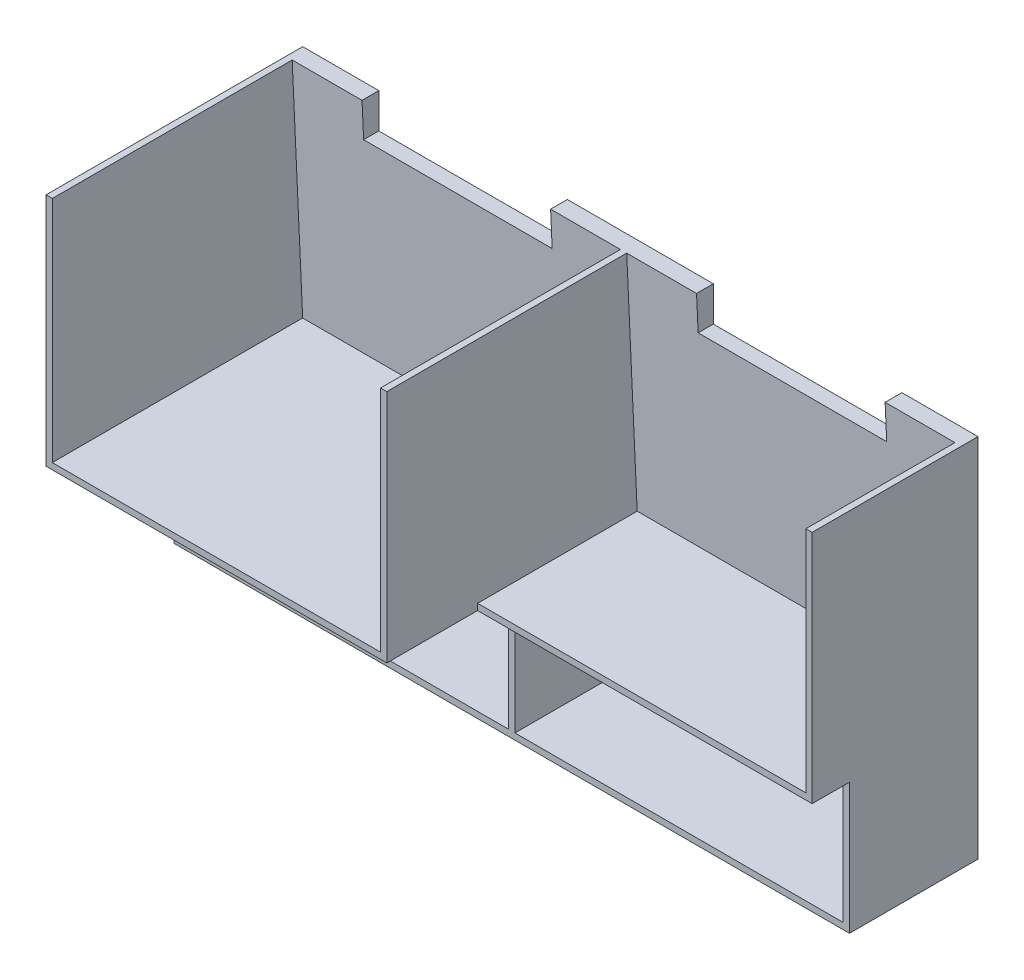
ISO-10303-21;
HEADER;
FILE_DESCRIPTION(('STEP AP214'),'2;1');
FILE_NAME('part.step','',(''),(''),'','','');
FILE_SCHEMA(('AUTOMOTIVE_DESIGN { 1 0 10303 214 1 1 1 1 }'));
ENDSEC;
DATA;
#1=APPLICATION_CONTEXT('core data for automotive mechanical design processes');
#2=APPLICATION_PROTOCOL_DEFINITION('international standard','automotive_design',2000,#1);
#3=PRODUCT_CONTEXT('',#1,'mechanical');
#4=PRODUCT('Part','Part','',(#3));
#5=PRODUCT_RELATED_PRODUCT_CATEGORY('part','',(#4));
#6=PRODUCT_DEFINITION_FORMATION('','',#4);
#7=PRODUCT_DEFINITION_CONTEXT('part definition',#1,'design');
#8=PRODUCT_DEFINITION('design','',#6,#7);
#9=PRODUCT_DEFINITION_SHAPE('','',#8);
#10=(LENGTH_UNIT() NAMED_UNIT(*) SI_UNIT(.MILLI.,.METRE.));
#11=(NAMED_UNIT(*) PLANE_ANGLE_UNIT() SI_UNIT($,.RADIAN.));
#12=(NAMED_UNIT(*) SI_UNIT($,.STERADIAN.) SOLID_ANGLE_UNIT());
#13=UNCERTAINTY_MEASURE_WITH_UNIT(LENGTH_MEASURE(1.E-05),#10,'distance_accuracy_value','');
#14=(GEOMETRIC_REPRESENTATION_CONTEXT(3) GLOBAL_UNCERTAINTY_ASSIGNED_CONTEXT((#13)) GLOBAL_UNIT_ASSIGNED_CONTEXT((#10,
#11,#12)) REPRESENTATION_CONTEXT('',''));
#15=CARTESIAN_POINT('',(0.,0.,0.));
#16=DIRECTION('',(0.,0.,1.));
#17=DIRECTION('',(1.,0.,0.));
#18=AXIS2_PLACEMENT_3D('',#15,#16,#17);
#19=CARTESIAN_POINT('',(0.,104.8,-1.8));
#20=DIRECTION('',(0.,-1.,0.));
#21=DIRECTION('',(0.,0.,-1.));
#22=AXIS2_PLACEMENT_3D('',#19,#20,#21);
#23=PLANE('',#22);
#24=DIRECTION('',(0.,0.,1.));
#25=VECTOR('',#24,1.);
#26=CARTESIAN_POINT('',(171.6,104.8,-16.));
#27=LINE('',#26,#25);
#28=CARTESIAN_POINT('',(171.6,104.8,-1.8));
#29=VERTEX_POINT('',#28);
#30=CARTESIAN_POINT('',(171.6,104.8,3.));
#31=VERTEX_POINT('',#30);
#32=EDGE_CURVE('E455',#29,#31,#27,.T.);
#33=ORIENTED_EDGE('',*,*,#32,.T.);
#34=DIRECTION('',(1.,0.,0.));
#35=VECTOR('',#34,1.);
#36=CARTESIAN_POINT('',(-63.768666297249,104.8,3.));
#37=LINE('',#36,#35);
#38=CARTESIAN_POINT('',(191.6,104.8,3.00000000000001));
#39=VERTEX_POINT('',#38);
#40=EDGE_CURVE('E432',#31,#39,#37,.T.);
#41=ORIENTED_EDGE('',*,*,#40,.T.);
#42=DIRECTION('',(0.,0.,-1.));
#43=VECTOR('',#42,1.);
#44=CARTESIAN_POINT('',(191.6,104.8,45.7));
#45=LINE('',#44,#43);
#46=CARTESIAN_POINT('',(191.6,104.8,45.7));
#47=VERTEX_POINT('',#46);
#48=EDGE_CURVE('E329',#47,#39,#45,.T.);
#49=ORIENTED_EDGE('',*,*,#48,.F.);
#50=DIRECTION('',(1.,0.,0.));
#51=VECTOR('',#50,1.);
#52=CARTESIAN_POINT('',(0.,104.8,45.7));
#53=LINE('',#52,#51);
#54=CARTESIAN_POINT('',(193.4,104.8,45.7));
#55=VERTEX_POINT('',#54);
#56=EDGE_CURVE('E348',#47,#55,#53,.T.);
#57=ORIENTED_EDGE('',*,*,#56,.T.);
#58=DIRECTION('',(0.,0.,1.));
#59=VECTOR('',#58,1.);
#60=CARTESIAN_POINT('',(193.4,104.8,-1.8));
#61=LINE('',#60,#59);
#62=CARTESIAN_POINT('',(193.4,104.8,-1.8));
#63=VERTEX_POINT('',#62);
#64=EDGE_CURVE('E510',#63,#55,#61,.T.);
#65=ORIENTED_EDGE('',*,*,#64,.F.);
#66=DIRECTION('',(1.,0.,0.));
#67=VECTOR('',#66,1.);
#68=CARTESIAN_POINT('',(0.,104.8,-1.8));
#69=LINE('',#68,#67);
#70=EDGE_CURVE('E268',#29,#63,#69,.T.);
#71=ORIENTED_EDGE('',*,*,#70,.F.);
#72=EDGE_LOOP('',(#33,#41,#49,#57,#65,#71));
#73=FACE_BOUND('',#72,.T.);
#74=ADVANCED_FACE('F39',(#73),#23,.F.);
#75=CARTESIAN_POINT('',(97.6,104.8,3.));
#76=VERTEX_POINT('',#75);
#77=CARTESIAN_POINT('',(117.6,104.8,3.));
#78=VERTEX_POINT('',#77);
#79=EDGE_CURVE('E433',#76,#78,#37,.T.);
#80=ORIENTED_EDGE('',*,*,#79,.T.);
#81=DIRECTION('',(0.,0.,1.));
#82=VECTOR('',#81,1.);
#83=CARTESIAN_POINT('',(117.6,104.8,-16.));
#84=LINE('',#83,#82);
#85=CARTESIAN_POINT('',(117.6,104.8,-1.8));
#86=VERTEX_POINT('',#85);
#87=EDGE_CURVE('E54',#86,#78,#84,.T.);
#88=ORIENTED_EDGE('',*,*,#87,.F.);
#89=CARTESIAN_POINT('',(75.8,104.8,-1.8));
#90=VERTEX_POINT('',#89);
#91=EDGE_CURVE('E266',#90,#86,#69,.T.);
#92=ORIENTED_EDGE('',*,*,#91,.F.);
#93=DIRECTION('',(0.,0.,1.));
#94=VECTOR('',#93,1.);
#95=CARTESIAN_POINT('',(75.8,104.8,-16.));
#96=LINE('',#95,#94);
#97=CARTESIAN_POINT('',(75.8,104.8,3.));
#98=VERTEX_POINT('',#97);
#99=EDGE_CURVE('E258',#90,#98,#96,.T.);
#100=ORIENTED_EDGE('',*,*,#99,.T.);
#101=CARTESIAN_POINT('',(95.8,104.8,3.));
#102=VERTEX_POINT('',#101);
#103=EDGE_CURVE('E431',#98,#102,#37,.T.);
#104=ORIENTED_EDGE('',*,*,#103,.T.);
#105=DIRECTION('',(0.,0.,-1.));
#106=VECTOR('',#105,1.);
#107=CARTESIAN_POINT('',(95.8,104.8,71.7));
#108=LINE('',#107,#106);
#109=CARTESIAN_POINT('',(95.8,104.8,71.7));
#110=VERTEX_POINT('',#109);
#111=EDGE_CURVE('E295',#110,#102,#108,.T.);
#112=ORIENTED_EDGE('',*,*,#111,.F.);
#113=DIRECTION('',(1.,0.,0.));
#114=VECTOR('',#113,1.);
#115=CARTESIAN_POINT('',(0.,104.8,71.7));
#116=LINE('',#115,#114);
#117=CARTESIAN_POINT('',(97.6,104.8,71.7));
#118=VERTEX_POINT('',#117);
#119=EDGE_CURVE('E298',#110,#118,#116,.T.);
#120=ORIENTED_EDGE('',*,*,#119,.T.);
#121=DIRECTION('',(0.,0.,-1.));
#122=VECTOR('',#121,1.);
#123=CARTESIAN_POINT('',(97.6,104.8,71.7));
#124=LINE('',#123,#122);
#125=EDGE_CURVE('E292',#118,#76,#124,.T.);
#126=ORIENTED_EDGE('',*,*,#125,.T.);
#127=EDGE_LOOP('',(#80,#88,#92,#100,#104,#112,#120,#126));
#128=FACE_BOUND('',#127,.T.);
#129=ADVANCED_FACE('F476',(#128),#23,.F.);
#130=CARTESIAN_POINT('',(0.,0.,-1.8));
#131=DIRECTION('',(0.,0.,1.));
#132=DIRECTION('',(1.,0.,0.));
#133=AXIS2_PLACEMENT_3D('',#130,#131,#132);
#134=PLANE('',#133);
#135=DIRECTION('',(0.,-1.,0.));
#136=VECTOR('',#135,1.);
#137=CARTESIAN_POINT('',(171.6,-4.76285677564192E-13,-1.8));
#138=LINE('',#137,#136);
#139=CARTESIAN_POINT('',(171.6,94.8,-1.8));
#140=VERTEX_POINT('',#139);
#141=EDGE_CURVE('E437',#29,#140,#138,.T.);
#142=ORIENTED_EDGE('',*,*,#141,.F.);
#143=ORIENTED_EDGE('',*,*,#70,.T.);
#144=DIRECTION('',(0.,1.,0.));
#145=VECTOR('',#144,1.);
#146=CARTESIAN_POINT('',(193.4,0.,-1.8));
#147=LINE('',#146,#145);
#148=CARTESIAN_POINT('',(193.4,0.,-1.8));
#149=VERTEX_POINT('',#148);
#150=EDGE_CURVE('E499',#149,#63,#147,.T.);
#151=ORIENTED_EDGE('',*,*,#150,.F.);
#152=DIRECTION('',(1.,0.,0.));
#153=VECTOR('',#152,1.);
#154=CARTESIAN_POINT('',(0.,0.,-1.8));
#155=LINE('',#154,#153);
#156=CARTESIAN_POINT('',(0.,0.,-1.8));
#157=VERTEX_POINT('',#156);
#158=EDGE_CURVE('E269',#157,#149,#155,.T.);
#159=ORIENTED_EDGE('',*,*,#158,.F.);
#160=DIRECTION('',(0.,1.,0.));
#161=VECTOR('',#160,1.);
#162=CARTESIAN_POINT('',(0.,0.,-1.8));
#163=LINE('',#162,#161);
#164=CARTESIAN_POINT('',(0.,104.8,-1.8));
#165=VERTEX_POINT('',#164);
#166=EDGE_CURVE('E264',#157,#165,#163,.T.);
#167=ORIENTED_EDGE('',*,*,#166,.T.);
#168=CARTESIAN_POINT('',(21.8,104.8,-1.8));
#169=VERTEX_POINT('',#168);
#170=EDGE_CURVE('E254',#165,#169,#69,.T.);
#171=ORIENTED_EDGE('',*,*,#170,.T.);
#172=DIRECTION('',(0.,-1.,0.));
#173=VECTOR('',#172,1.);
#174=CARTESIAN_POINT('',(21.8,0.,-1.8));
#175=LINE('',#174,#173);
#176=CARTESIAN_POINT('',(21.8,94.8,-1.8));
#177=VERTEX_POINT('',#176);
#178=EDGE_CURVE('E241',#169,#177,#175,.T.);
#179=ORIENTED_EDGE('',*,*,#178,.T.);
#180=DIRECTION('',(1.,0.,0.));
#181=VECTOR('',#180,1.);
#182=CARTESIAN_POINT('',(0.,94.8,-1.8));
#183=LINE('',#182,#181);
#184=CARTESIAN_POINT('',(75.8,94.8,-1.8));
#185=VERTEX_POINT('',#184);
#186=EDGE_CURVE('E248',#177,#185,#183,.T.);
#187=ORIENTED_EDGE('',*,*,#186,.T.);
#188=DIRECTION('',(0.,-1.,0.));
#189=VECTOR('',#188,1.);
#190=CARTESIAN_POINT('',(75.8,0.,-1.8));
#191=LINE('',#190,#189);
#192=EDGE_CURVE('E446',#90,#185,#191,.T.);
#193=ORIENTED_EDGE('',*,*,#192,.F.);
#194=ORIENTED_EDGE('',*,*,#91,.T.);
#195=DIRECTION('',(0.,-1.,0.));
#196=VECTOR('',#195,1.);
#197=CARTESIAN_POINT('',(117.6,0.,-1.8));
#198=LINE('',#197,#196);
#199=CARTESIAN_POINT('',(117.6,94.8,-1.8));
#200=VERTEX_POINT('',#199);
#201=EDGE_CURVE('E443',#86,#200,#198,.T.);
#202=ORIENTED_EDGE('',*,*,#201,.T.);
#203=DIRECTION('',(1.,0.,0.));
#204=VECTOR('',#203,1.);
#205=CARTESIAN_POINT('',(0.,94.8,-1.8));
#206=LINE('',#205,#204);
#207=EDGE_CURVE('E440',#200,#140,#206,.T.);
#208=ORIENTED_EDGE('',*,*,#207,.T.);
#209=EDGE_LOOP('',(#142,#143,#151,#159,#167,#171,#179,#187,#193,#194,#202,#208));
#210=FACE_BOUND('',#209,.T.);
#211=ADVANCED_FACE('F261',(#210),#134,.F.);
#212=CARTESIAN_POINT('',(-63.768666297249,0.0822701634005932,-1.79623190091295));
#213=DIRECTION('',(0.,-0.0457535614099546,0.998952757450674));
#214=DIRECTION('',(0.,-0.998952757450674,-0.0457535614099546));
#215=AXIS2_PLACEMENT_3D('',#212,#213,#214);
#216=PLANE('',#215);
#217=ORIENTED_EDGE('',*,*,#40,.F.);
#218=DIRECTION('',(0.,-0.998952757450674,-0.0457535614099546));
#219=VECTOR('',#218,1.);
#220=CARTESIAN_POINT('',(171.6,0.0822701633999413,-1.79623190091298));
#221=LINE('',#220,#219);
#222=CARTESIAN_POINT('',(171.6,94.8,2.54198473282443));
#223=VERTEX_POINT('',#222);
#224=EDGE_CURVE('E11',#31,#223,#221,.T.);
#225=ORIENTED_EDGE('',*,*,#224,.T.);
#226=DIRECTION('',(1.,0.,0.));
#227=VECTOR('',#226,1.);
#228=CARTESIAN_POINT('',(-63.768666297249,94.8,2.54198473282443));
#229=LINE('',#228,#227);
#230=CARTESIAN_POINT('',(117.6,94.8,2.54198473282443));
#231=VERTEX_POINT('',#230);
#232=EDGE_CURVE('E47',#231,#223,#229,.T.);
#233=ORIENTED_EDGE('',*,*,#232,.F.);
#234=DIRECTION('',(0.,-0.998952757450674,-0.0457535614099546));
#235=VECTOR('',#234,1.);
#236=CARTESIAN_POINT('',(117.6,0.0822701634005932,-1.79623190091295));
#237=LINE('',#236,#235);
#238=EDGE_CURVE('E514',#78,#231,#237,.T.);
#239=ORIENTED_EDGE('',*,*,#238,.F.);
#240=ORIENTED_EDGE('',*,*,#79,.F.);
#241=DIRECTION('',(0.,-0.998952757450674,-0.0457535614099546));
#242=VECTOR('',#241,1.);
#243=CARTESIAN_POINT('',(97.6,3.35936500552422,-1.64613595394546));
#244=LINE('',#243,#242);
#245=CARTESIAN_POINT('',(97.6,39.3,0.));
#246=VERTEX_POINT('',#245);
#247=EDGE_CURVE('E426',#76,#246,#244,.T.);
#248=ORIENTED_EDGE('',*,*,#247,.T.);
#249=DIRECTION('',(1.,0.,0.));
#250=VECTOR('',#249,1.);
#251=CARTESIAN_POINT('',(0.,39.3,0.));
#252=LINE('',#251,#250);
#253=CARTESIAN_POINT('',(191.6,39.3,0.));
#254=VERTEX_POINT('',#253);
#255=EDGE_CURVE('E337',#246,#254,#252,.T.);
#256=ORIENTED_EDGE('',*,*,#255,.T.);
#257=DIRECTION('',(0.,-0.998952757450674,-0.0457535614099546));
#258=VECTOR('',#257,1.);
#259=CARTESIAN_POINT('',(191.6,0.0822701634005932,-1.79623190091295));
#260=LINE('',#259,#258);
#261=EDGE_CURVE('E434',#39,#254,#260,.T.);
#262=ORIENTED_EDGE('',*,*,#261,.F.);
#263=EDGE_LOOP('',(#217,#225,#233,#239,#240,#248,#256,#262));
#264=FACE_BOUND('',#263,.T.);
#265=ADVANCED_FACE('F470',(#264),#216,.T.);
#266=ORIENTED_EDGE('',*,*,#103,.F.);
#267=DIRECTION('',(0.,-0.998952757450674,-0.0457535614099546));
#268=VECTOR('',#267,1.);
#269=CARTESIAN_POINT('',(75.8,0.0822701634005932,-1.79623190091295));
#270=LINE('',#269,#268);
#271=CARTESIAN_POINT('',(75.8,94.8,2.54198473282443));
#272=VERTEX_POINT('',#271);
#273=EDGE_CURVE('E512',#98,#272,#270,.T.);
#274=ORIENTED_EDGE('',*,*,#273,.T.);
#275=DIRECTION('',(1.,0.,0.));
#276=VECTOR('',#275,1.);
#277=CARTESIAN_POINT('',(-63.768666297249,94.8,2.54198473282443));
#278=LINE('',#277,#276);
#279=CARTESIAN_POINT('',(21.8,94.8,2.54198473282443));
#280=VERTEX_POINT('',#279);
#281=EDGE_CURVE('E509',#280,#272,#278,.T.);
#282=ORIENTED_EDGE('',*,*,#281,.F.);
#283=DIRECTION('',(0.,-0.998952757450674,-0.0457535614099546));
#284=VECTOR('',#283,1.);
#285=CARTESIAN_POINT('',(21.8,0.0822701634005932,-1.79623190091295));
#286=LINE('',#285,#284);
#287=CARTESIAN_POINT('',(21.8,104.8,3.));
#288=VERTEX_POINT('',#287);
#289=EDGE_CURVE('E507',#288,#280,#286,.T.);
#290=ORIENTED_EDGE('',*,*,#289,.F.);
#291=CARTESIAN_POINT('',(1.8,104.8,3.));
#292=VERTEX_POINT('',#291);
#293=EDGE_CURVE('E257',#292,#288,#37,.T.);
#294=ORIENTED_EDGE('',*,*,#293,.F.);
#295=DIRECTION('',(0.,0.998952757450674,0.0457535614099546));
#296=VECTOR('',#295,1.);
#297=CARTESIAN_POINT('',(1.80000000000001,0.0822701634006012,-1.79623190091295));
#298=LINE('',#297,#296);
#299=CARTESIAN_POINT('',(1.80000000000001,39.3,0.));
#300=VERTEX_POINT('',#299);
#301=EDGE_CURVE('E429',#300,#292,#298,.T.);
#302=ORIENTED_EDGE('',*,*,#301,.F.);
#303=DIRECTION('',(1.,0.,0.));
#304=VECTOR('',#303,1.);
#305=CARTESIAN_POINT('',(0.,39.3,0.));
#306=LINE('',#305,#304);
#307=CARTESIAN_POINT('',(95.8,39.3,0.));
#308=VERTEX_POINT('',#307);
#309=EDGE_CURVE('E303',#300,#308,#306,.T.);
#310=ORIENTED_EDGE('',*,*,#309,.T.);
#311=DIRECTION('',(0.,-0.998952757450674,-0.0457535614099546));
#312=VECTOR('',#311,1.);
#313=CARTESIAN_POINT('',(95.8,3.35936500552424,-1.64613595394546));
#314=LINE('',#313,#312);
#315=EDGE_CURVE('E393',#102,#308,#314,.T.);
#316=ORIENTED_EDGE('',*,*,#315,.F.);
#317=EDGE_LOOP('',(#266,#274,#282,#290,#294,#302,#310,#316));
#318=FACE_BOUND('',#317,.T.);
#319=ADVANCED_FACE('F485',(#318),#216,.T.);
#320=CARTESIAN_POINT('',(0.,0.,0.));
#321=DIRECTION('',(0.,0.,1.));
#322=DIRECTION('',(1.,0.,0.));
#323=AXIS2_PLACEMENT_3D('',#320,#321,#322);
#324=PLANE('',#323);
#325=DIRECTION('',(1.,0.,0.));
#326=VECTOR('',#325,1.);
#327=CARTESIAN_POINT('',(0.,1.8,0.));
#328=LINE('',#327,#326);
#329=CARTESIAN_POINT('',(97.6,1.8,0.));
#330=VERTEX_POINT('',#329);
#331=CARTESIAN_POINT('',(191.6,1.8,0.));
#332=VERTEX_POINT('',#331);
#333=EDGE_CURVE('E388',#330,#332,#328,.T.);
#334=ORIENTED_EDGE('',*,*,#333,.T.);
#335=DIRECTION('',(0.,-1.,0.));
#336=VECTOR('',#335,1.);
#337=CARTESIAN_POINT('',(191.6,0.,0.));
#338=LINE('',#337,#336);
#339=CARTESIAN_POINT('',(191.6,37.5,0.));
#340=VERTEX_POINT('',#339);
#341=EDGE_CURVE('E390',#340,#332,#338,.T.);
#342=ORIENTED_EDGE('',*,*,#341,.F.);
#343=DIRECTION('',(-1.,0.,0.));
#344=VECTOR('',#343,1.);
#345=CARTESIAN_POINT('',(0.,37.5,0.));
#346=LINE('',#345,#344);
#347=CARTESIAN_POINT('',(97.6,37.5,0.));
#348=VERTEX_POINT('',#347);
#349=EDGE_CURVE('E302',#340,#348,#346,.T.);
#350=ORIENTED_EDGE('',*,*,#349,.T.);
#351=DIRECTION('',(0.,-1.,0.));
#352=VECTOR('',#351,1.);
#353=CARTESIAN_POINT('',(97.6,0.,0.));
#354=LINE('',#353,#352);
#355=EDGE_CURVE('E386',#348,#330,#354,.T.);
#356=ORIENTED_EDGE('',*,*,#355,.T.);
#357=EDGE_LOOP('',(#334,#342,#350,#356));
#358=FACE_BOUND('',#357,.T.);
#359=ADVANCED_FACE('F573',(#358),#324,.T.);
#360=DIRECTION('',(1.,0.,0.));
#361=VECTOR('',#360,1.);
#362=CARTESIAN_POINT('',(0.,1.8,0.));
#363=LINE('',#362,#361);
#364=CARTESIAN_POINT('',(1.8,1.8,0.));
#365=VERTEX_POINT('',#364);
#366=CARTESIAN_POINT('',(95.8,1.8,0.));
#367=VERTEX_POINT('',#366);
#368=EDGE_CURVE('E381',#365,#367,#363,.T.);
#369=ORIENTED_EDGE('',*,*,#368,.T.);
#370=DIRECTION('',(0.,-1.,0.));
#371=VECTOR('',#370,1.);
#372=CARTESIAN_POINT('',(95.8,0.,0.));
#373=LINE('',#372,#371);
#374=CARTESIAN_POINT('',(95.8,37.5,0.));
#375=VERTEX_POINT('',#374);
#376=EDGE_CURVE('E383',#375,#367,#373,.T.);
#377=ORIENTED_EDGE('',*,*,#376,.F.);
#378=CARTESIAN_POINT('',(1.8,37.5,0.));
#379=VERTEX_POINT('',#378);
#380=EDGE_CURVE('E299',#375,#379,#346,.T.);
#381=ORIENTED_EDGE('',*,*,#380,.T.);
#382=DIRECTION('',(0.,-1.,0.));
#383=VECTOR('',#382,1.);
#384=CARTESIAN_POINT('',(1.8,0.,0.));
#385=LINE('',#384,#383);
#386=EDGE_CURVE('E378',#379,#365,#385,.T.);
#387=ORIENTED_EDGE('',*,*,#386,.T.);
#388=EDGE_LOOP('',(#369,#377,#381,#387));
#389=FACE_BOUND('',#388,.T.);
#390=ADVANCED_FACE('F567',(#389),#324,.T.);
#391=CARTESIAN_POINT('',(0.,37.5,71.7));
#392=DIRECTION('',(0.,-1.,0.));
#393=DIRECTION('',(0.,0.,-1.));
#394=AXIS2_PLACEMENT_3D('',#391,#392,#393);
#395=PLANE('',#394);
#396=ORIENTED_EDGE('',*,*,#349,.F.);
#397=DIRECTION('',(0.,0.,-1.));
#398=VECTOR('',#397,1.);
#399=CARTESIAN_POINT('',(191.6,37.5,35.));
#400=LINE('',#399,#398);
#401=CARTESIAN_POINT('',(191.6,37.5,35.));
#402=VERTEX_POINT('',#401);
#403=EDGE_CURVE('E341',#402,#340,#400,.T.);
#404=ORIENTED_EDGE('',*,*,#403,.F.);
#405=DIRECTION('',(1.,0.,0.));
#406=VECTOR('',#405,1.);
#407=CARTESIAN_POINT('',(0.,37.5,35.));
#408=LINE('',#407,#406);
#409=CARTESIAN_POINT('',(193.4,37.5,35.));
#410=VERTEX_POINT('',#409);
#411=EDGE_CURVE('E380',#402,#410,#408,.T.);
#412=ORIENTED_EDGE('',*,*,#411,.T.);
#413=DIRECTION('',(0.,0.,-1.));
#414=VECTOR('',#413,1.);
#415=CARTESIAN_POINT('',(193.4,37.5,45.7));
#416=LINE('',#415,#414);
#417=CARTESIAN_POINT('',(193.4,37.5,45.7));
#418=VERTEX_POINT('',#417);
#419=EDGE_CURVE('E305',#418,#410,#416,.T.);
#420=ORIENTED_EDGE('',*,*,#419,.F.);
#421=DIRECTION('',(1.,0.,0.));
#422=VECTOR('',#421,1.);
#423=CARTESIAN_POINT('',(0.,37.5,45.7));
#424=LINE('',#423,#422);
#425=CARTESIAN_POINT('',(97.6,37.5,45.7));
#426=VERTEX_POINT('',#425);
#427=EDGE_CURVE('E340',#426,#418,#424,.T.);
#428=ORIENTED_EDGE('',*,*,#427,.F.);
#429=DIRECTION('',(0.,0.,-1.));
#430=VECTOR('',#429,1.);
#431=CARTESIAN_POINT('',(97.6,37.5,71.7));
#432=LINE('',#431,#430);
#433=CARTESIAN_POINT('',(97.6,37.5,71.7));
#434=VERTEX_POINT('',#433);
#435=EDGE_CURVE('E290',#434,#426,#432,.T.);
#436=ORIENTED_EDGE('',*,*,#435,.F.);
#437=DIRECTION('',(-1.,0.,0.));
#438=VECTOR('',#437,1.);
#439=CARTESIAN_POINT('',(0.,37.5,71.7));
#440=LINE('',#439,#438);
#441=CARTESIAN_POINT('',(0.,37.5,71.7));
#442=VERTEX_POINT('',#441);
#443=EDGE_CURVE('E311',#434,#442,#440,.T.);
#444=ORIENTED_EDGE('',*,*,#443,.T.);
#445=DIRECTION('',(0.,0.,-1.));
#446=VECTOR('',#445,1.);
#447=CARTESIAN_POINT('',(0.,37.5,71.7));
#448=LINE('',#447,#446);
#449=CARTESIAN_POINT('',(0.,37.5,35.));
#450=VERTEX_POINT('',#449);
#451=EDGE_CURVE('E288',#442,#450,#448,.T.);
#452=ORIENTED_EDGE('',*,*,#451,.T.);
#453=DIRECTION('',(-1.,0.,0.));
#454=VECTOR('',#453,1.);
#455=CARTESIAN_POINT('',(0.,37.5,35.));
#456=LINE('',#455,#454);
#457=CARTESIAN_POINT('',(1.8,37.5,35.));
#458=VERTEX_POINT('',#457);
#459=EDGE_CURVE('E402',#458,#450,#456,.T.);
#460=ORIENTED_EDGE('',*,*,#459,.F.);
#461=DIRECTION('',(0.,0.,-1.));
#462=VECTOR('',#461,1.);
#463=CARTESIAN_POINT('',(1.8,37.5,35.));
#464=LINE('',#463,#462);
#465=EDGE_CURVE('E375',#458,#379,#464,.T.);
#466=ORIENTED_EDGE('',*,*,#465,.T.);
#467=ORIENTED_EDGE('',*,*,#380,.F.);
#468=DIRECTION('',(0.,0.,-1.));
#469=VECTOR('',#468,1.);
#470=CARTESIAN_POINT('',(95.8,37.5,35.));
#471=LINE('',#470,#469);
#472=CARTESIAN_POINT('',(95.8,37.5,35.));
#473=VERTEX_POINT('',#472);
#474=EDGE_CURVE('E366',#473,#375,#471,.T.);
#475=ORIENTED_EDGE('',*,*,#474,.F.);
#476=DIRECTION('',(-1.,0.,0.));
#477=VECTOR('',#476,1.);
#478=CARTESIAN_POINT('',(0.,37.5,35.));
#479=LINE('',#478,#477);
#480=CARTESIAN_POINT('',(97.6,37.5,35.));
#481=VERTEX_POINT('',#480);
#482=EDGE_CURVE('E413',#481,#473,#479,.T.);
#483=ORIENTED_EDGE('',*,*,#482,.F.);
#484=DIRECTION('',(0.,0.,-1.));
#485=VECTOR('',#484,1.);
#486=CARTESIAN_POINT('',(97.6,37.5,35.));
#487=LINE('',#486,#485);
#488=EDGE_CURVE('E364',#481,#348,#487,.T.);
#489=ORIENTED_EDGE('',*,*,#488,.T.);
#490=EDGE_LOOP('',(#396,#404,#412,#420,#428,#436,#444,#452,#460,#466,#467,#475,#483,#489));
#491=FACE_BOUND('',#490,.T.);
#492=ADVANCED_FACE('F561',(#491),#395,.T.);
#493=ORIENTED_EDGE('',*,*,#293,.T.);
#494=DIRECTION('',(0.,0.,1.));
#495=VECTOR('',#494,1.);
#496=CARTESIAN_POINT('',(21.8,104.8,-16.));
#497=LINE('',#496,#495);
#498=EDGE_CURVE('E62',#169,#288,#497,.T.);
#499=ORIENTED_EDGE('',*,*,#498,.F.);
#500=ORIENTED_EDGE('',*,*,#170,.F.);
#501=DIRECTION('',(0.,0.,1.));
#502=VECTOR('',#501,1.);
#503=CARTESIAN_POINT('',(0.,104.8,-1.8));
#504=LINE('',#503,#502);
#505=CARTESIAN_POINT('',(0.,104.8,71.7));
#506=VERTEX_POINT('',#505);
#507=EDGE_CURVE('E496',#165,#506,#504,.T.);
#508=ORIENTED_EDGE('',*,*,#507,.T.);
#509=DIRECTION('',(1.,0.,0.));
#510=VECTOR('',#509,1.);
#511=CARTESIAN_POINT('',(0.,104.8,71.7));
#512=LINE('',#511,#510);
#513=CARTESIAN_POINT('',(1.8,104.8,71.7));
#514=VERTEX_POINT('',#513);
#515=EDGE_CURVE('E317',#506,#514,#512,.T.);
#516=ORIENTED_EDGE('',*,*,#515,.T.);
#517=DIRECTION('',(0.,0.,-1.));
#518=VECTOR('',#517,1.);
#519=CARTESIAN_POINT('',(1.8,104.8,71.7));
#520=LINE('',#519,#518);
#521=EDGE_CURVE('E284',#514,#292,#520,.T.);
#522=ORIENTED_EDGE('',*,*,#521,.T.);
#523=EDGE_LOOP('',(#493,#499,#500,#508,#516,#522));
#524=FACE_BOUND('',#523,.T.);
#525=ADVANCED_FACE('F41',(#524),#23,.F.);
#526=CARTESIAN_POINT('',(193.4,0.,-1.8));
#527=DIRECTION('',(1.,0.,0.));
#528=DIRECTION('',(0.,0.,-1.));
#529=AXIS2_PLACEMENT_3D('',#526,#527,#528);
#530=PLANE('',#529);
#531=DIRECTION('',(0.,1.,0.));
#532=VECTOR('',#531,1.);
#533=CARTESIAN_POINT('',(193.4,0.,35.));
#534=LINE('',#533,#532);
#535=CARTESIAN_POINT('',(193.4,0.,35.));
#536=VERTEX_POINT('',#535);
#537=EDGE_CURVE('E377',#536,#410,#534,.T.);
#538=ORIENTED_EDGE('',*,*,#537,.F.);
#539=DIRECTION('',(0.,0.,1.));
#540=VECTOR('',#539,1.);
#541=CARTESIAN_POINT('',(193.4,0.,-1.8));
#542=LINE('',#541,#540);
#543=EDGE_CURVE('E501',#149,#536,#542,.T.);
#544=ORIENTED_EDGE('',*,*,#543,.F.);
#545=ORIENTED_EDGE('',*,*,#150,.T.);
#546=ORIENTED_EDGE('',*,*,#64,.T.);
#547=DIRECTION('',(0.,1.,0.));
#548=VECTOR('',#547,1.);
#549=CARTESIAN_POINT('',(193.4,0.,45.7));
#550=LINE('',#549,#548);
#551=EDGE_CURVE('E351',#418,#55,#550,.T.);
#552=ORIENTED_EDGE('',*,*,#551,.F.);
#553=ORIENTED_EDGE('',*,*,#419,.T.);
#554=EDGE_LOOP('',(#538,#544,#545,#546,#552,#553));
#555=FACE_BOUND('',#554,.T.);
#556=ADVANCED_FACE('F540',(#555),#530,.T.);
#557=CARTESIAN_POINT('',(0.,0.,-1.8));
#558=DIRECTION('',(0.,-1.,0.));
#559=DIRECTION('',(0.,0.,-1.));
#560=AXIS2_PLACEMENT_3D('',#557,#558,#559);
#561=PLANE('',#560);
#562=ORIENTED_EDGE('',*,*,#543,.T.);
#563=DIRECTION('',(1.,0.,0.));
#564=VECTOR('',#563,1.);
#565=CARTESIAN_POINT('',(0.,0.,35.));
#566=LINE('',#565,#564);
#567=CARTESIAN_POINT('',(0.,0.,35.));
#568=VERTEX_POINT('',#567);
#569=EDGE_CURVE('E396',#568,#536,#566,.T.);
#570=ORIENTED_EDGE('',*,*,#569,.F.);
#571=DIRECTION('',(0.,0.,1.));
#572=VECTOR('',#571,1.);
#573=CARTESIAN_POINT('',(0.,0.,-1.8));
#574=LINE('',#573,#572);
#575=EDGE_CURVE('E498',#157,#568,#574,.T.);
#576=ORIENTED_EDGE('',*,*,#575,.F.);
#577=ORIENTED_EDGE('',*,*,#158,.T.);
#578=EDGE_LOOP('',(#562,#570,#576,#577));
#579=FACE_BOUND('',#578,.T.);
#580=ADVANCED_FACE('F545',(#579),#561,.T.);
#581=CARTESIAN_POINT('',(0.,0.,-1.8));
#582=DIRECTION('',(1.,0.,0.));
#583=DIRECTION('',(0.,0.,-1.));
#584=AXIS2_PLACEMENT_3D('',#581,#582,#583);
#585=PLANE('',#584);
#586=ORIENTED_EDGE('',*,*,#575,.T.);
#587=DIRECTION('',(0.,1.,0.));
#588=VECTOR('',#587,1.);
#589=CARTESIAN_POINT('',(0.,0.,35.));
#590=LINE('',#589,#588);
#591=EDGE_CURVE('E399',#568,#450,#590,.T.);
#592=ORIENTED_EDGE('',*,*,#591,.T.);
#593=ORIENTED_EDGE('',*,*,#451,.F.);
#594=DIRECTION('',(0.,1.,0.));
#595=VECTOR('',#594,1.);
#596=CARTESIAN_POINT('',(0.,0.,71.7));
#597=LINE('',#596,#595);
#598=EDGE_CURVE('E314',#442,#506,#597,.T.);
#599=ORIENTED_EDGE('',*,*,#598,.T.);
#600=ORIENTED_EDGE('',*,*,#507,.F.);
#601=ORIENTED_EDGE('',*,*,#166,.F.);
#602=EDGE_LOOP('',(#586,#592,#593,#599,#600,#601));
#603=FACE_BOUND('',#602,.T.);
#604=ADVANCED_FACE('F548',(#603),#585,.F.);
#605=CARTESIAN_POINT('',(95.8,0.,71.7));
#606=DIRECTION('',(1.,0.,0.));
#607=DIRECTION('',(0.,1.,0.));
#608=AXIS2_PLACEMENT_3D('',#605,#606,#607);
#609=PLANE('',#608);
#610=ORIENTED_EDGE('',*,*,#111,.T.);
#611=ORIENTED_EDGE('',*,*,#315,.T.);
#612=DIRECTION('',(0.,0.,-1.));
#613=VECTOR('',#612,1.);
#614=CARTESIAN_POINT('',(95.8,39.3,71.7));
#615=LINE('',#614,#613);
#616=CARTESIAN_POINT('',(95.8,39.3,71.7));
#617=VERTEX_POINT('',#616);
#618=EDGE_CURVE('E273',#617,#308,#615,.T.);
#619=ORIENTED_EDGE('',*,*,#618,.F.);
#620=DIRECTION('',(0.,-1.,0.));
#621=VECTOR('',#620,1.);
#622=CARTESIAN_POINT('',(95.8,0.,71.7));
#623=LINE('',#622,#621);
#624=EDGE_CURVE('E325',#110,#617,#623,.T.);
#625=ORIENTED_EDGE('',*,*,#624,.F.);
#626=EDGE_LOOP('',(#610,#611,#619,#625));
#627=FACE_BOUND('',#626,.T.);
#628=ADVANCED_FACE('F483',(#627),#609,.F.);
#629=CARTESIAN_POINT('',(0.,39.3,71.7));
#630=DIRECTION('',(0.,1.,0.));
#631=DIRECTION('',(0.,0.,1.));
#632=AXIS2_PLACEMENT_3D('',#629,#630,#631);
#633=PLANE('',#632);
#634=ORIENTED_EDGE('',*,*,#309,.F.);
#635=DIRECTION('',(0.,0.,-1.));
#636=VECTOR('',#635,1.);
#637=CARTESIAN_POINT('',(1.80000000000001,39.3,71.7));
#638=LINE('',#637,#636);
#639=CARTESIAN_POINT('',(1.80000000000001,39.3,71.7));
#640=VERTEX_POINT('',#639);
#641=EDGE_CURVE('E278',#640,#300,#638,.T.);
#642=ORIENTED_EDGE('',*,*,#641,.F.);
#643=DIRECTION('',(1.,0.,0.));
#644=VECTOR('',#643,1.);
#645=CARTESIAN_POINT('',(0.,39.3,71.7));
#646=LINE('',#645,#644);
#647=EDGE_CURVE('E323',#640,#617,#646,.T.);
#648=ORIENTED_EDGE('',*,*,#647,.T.);
#649=ORIENTED_EDGE('',*,*,#618,.T.);
#650=EDGE_LOOP('',(#634,#642,#648,#649));
#651=FACE_BOUND('',#650,.T.);
#652=ADVANCED_FACE('F487',(#651),#633,.T.);
#653=CARTESIAN_POINT('',(1.80000000000001,0.,71.7));
#654=DIRECTION('',(1.,0.,0.));
#655=DIRECTION('',(0.,1.,0.));
#656=AXIS2_PLACEMENT_3D('',#653,#654,#655);
#657=PLANE('',#656);
#658=ORIENTED_EDGE('',*,*,#301,.T.);
#659=ORIENTED_EDGE('',*,*,#521,.F.);
#660=DIRECTION('',(0.,-1.,0.));
#661=VECTOR('',#660,1.);
#662=CARTESIAN_POINT('',(1.80000000000001,0.,71.7));
#663=LINE('',#662,#661);
#664=EDGE_CURVE('E320',#514,#640,#663,.T.);
#665=ORIENTED_EDGE('',*,*,#664,.T.);
#666=ORIENTED_EDGE('',*,*,#641,.T.);
#667=EDGE_LOOP('',(#658,#659,#665,#666));
#668=FACE_BOUND('',#667,.T.);
#669=ADVANCED_FACE('F490',(#668),#657,.T.);
#670=CARTESIAN_POINT('',(97.6,0.,71.7));
#671=DIRECTION('',(1.,0.,0.));
#672=DIRECTION('',(0.,0.,-1.));
#673=AXIS2_PLACEMENT_3D('',#670,#671,#672);
#674=PLANE('',#673);
#675=ORIENTED_EDGE('',*,*,#247,.F.);
#676=ORIENTED_EDGE('',*,*,#125,.F.);
#677=DIRECTION('',(0.,-1.,0.));
#678=VECTOR('',#677,1.);
#679=CARTESIAN_POINT('',(97.6,0.,71.7));
#680=LINE('',#679,#678);
#681=EDGE_CURVE('E308',#118,#434,#680,.T.);
#682=ORIENTED_EDGE('',*,*,#681,.T.);
#683=ORIENTED_EDGE('',*,*,#435,.T.);
#684=DIRECTION('',(0.,1.,0.));
#685=VECTOR('',#684,1.);
#686=CARTESIAN_POINT('',(97.6,0.,45.7));
#687=LINE('',#686,#685);
#688=CARTESIAN_POINT('',(97.6,39.3,45.7));
#689=VERTEX_POINT('',#688);
#690=EDGE_CURVE('E336',#426,#689,#687,.T.);
#691=ORIENTED_EDGE('',*,*,#690,.T.);
#692=DIRECTION('',(0.,0.,-1.));
#693=VECTOR('',#692,1.);
#694=CARTESIAN_POINT('',(97.6,39.3,45.7));
#695=LINE('',#694,#693);
#696=EDGE_CURVE('E334',#689,#246,#695,.T.);
#697=ORIENTED_EDGE('',*,*,#696,.T.);
#698=EDGE_LOOP('',(#675,#676,#682,#683,#691,#697));
#699=FACE_BOUND('',#698,.T.);
#700=ADVANCED_FACE('F522',(#699),#674,.T.);
#701=CARTESIAN_POINT('',(0.,0.,71.7));
#702=DIRECTION('',(0.,0.,1.));
#703=DIRECTION('',(1.,0.,0.));
#704=AXIS2_PLACEMENT_3D('',#701,#702,#703);
#705=PLANE('',#704);
#706=ORIENTED_EDGE('',*,*,#624,.T.);
#707=ORIENTED_EDGE('',*,*,#647,.F.);
#708=ORIENTED_EDGE('',*,*,#664,.F.);
#709=ORIENTED_EDGE('',*,*,#515,.F.);
#710=ORIENTED_EDGE('',*,*,#598,.F.);
#711=ORIENTED_EDGE('',*,*,#443,.F.);
#712=ORIENTED_EDGE('',*,*,#681,.F.);
#713=ORIENTED_EDGE('',*,*,#119,.F.);
#714=EDGE_LOOP('',(#706,#707,#708,#709,#710,#711,#712,#713));
#715=FACE_BOUND('',#714,.T.);
#716=ADVANCED_FACE('F494',(#715),#705,.T.);
#717=CARTESIAN_POINT('',(191.6,0.,45.7));
#718=DIRECTION('',(1.,0.,0.));
#719=DIRECTION('',(0.,0.,-1.));
#720=AXIS2_PLACEMENT_3D('',#717,#718,#719);
#721=PLANE('',#720);
#722=ORIENTED_EDGE('',*,*,#48,.T.);
#723=ORIENTED_EDGE('',*,*,#261,.T.);
#724=DIRECTION('',(0.,0.,-1.));
#725=VECTOR('',#724,1.);
#726=CARTESIAN_POINT('',(191.6,39.3,45.7));
#727=LINE('',#726,#725);
#728=CARTESIAN_POINT('',(191.6,39.3,45.7));
#729=VERTEX_POINT('',#728);
#730=EDGE_CURVE('E332',#729,#254,#727,.T.);
#731=ORIENTED_EDGE('',*,*,#730,.F.);
#732=DIRECTION('',(0.,-1.,0.));
#733=VECTOR('',#732,1.);
#734=CARTESIAN_POINT('',(191.6,0.,45.7));
#735=LINE('',#734,#733);
#736=EDGE_CURVE('E346',#47,#729,#735,.T.);
#737=ORIENTED_EDGE('',*,*,#736,.F.);
#738=EDGE_LOOP('',(#722,#723,#731,#737));
#739=FACE_BOUND('',#738,.T.);
#740=ADVANCED_FACE('F532',(#739),#721,.F.);
#741=CARTESIAN_POINT('',(0.,39.3,45.7));
#742=DIRECTION('',(0.,1.,0.));
#743=DIRECTION('',(0.,0.,1.));
#744=AXIS2_PLACEMENT_3D('',#741,#742,#743);
#745=PLANE('',#744);
#746=ORIENTED_EDGE('',*,*,#255,.F.);
#747=ORIENTED_EDGE('',*,*,#696,.F.);
#748=DIRECTION('',(1.,0.,0.));
#749=VECTOR('',#748,1.);
#750=CARTESIAN_POINT('',(0.,39.3,45.7));
#751=LINE('',#750,#749);
#752=EDGE_CURVE('E343',#689,#729,#751,.T.);
#753=ORIENTED_EDGE('',*,*,#752,.T.);
#754=ORIENTED_EDGE('',*,*,#730,.T.);
#755=EDGE_LOOP('',(#746,#747,#753,#754));
#756=FACE_BOUND('',#755,.T.);
#757=ADVANCED_FACE('F528',(#756),#745,.T.);
#758=CARTESIAN_POINT('',(0.,0.,45.7));
#759=DIRECTION('',(0.,0.,1.));
#760=DIRECTION('',(1.,0.,0.));
#761=AXIS2_PLACEMENT_3D('',#758,#759,#760);
#762=PLANE('',#761);
#763=ORIENTED_EDGE('',*,*,#427,.T.);
#764=ORIENTED_EDGE('',*,*,#551,.T.);
#765=ORIENTED_EDGE('',*,*,#56,.F.);
#766=ORIENTED_EDGE('',*,*,#736,.T.);
#767=ORIENTED_EDGE('',*,*,#752,.F.);
#768=ORIENTED_EDGE('',*,*,#690,.F.);
#769=EDGE_LOOP('',(#763,#764,#765,#766,#767,#768));
#770=FACE_BOUND('',#769,.T.);
#771=ADVANCED_FACE('F535',(#770),#762,.T.);
#772=CARTESIAN_POINT('',(191.6,0.,35.));
#773=DIRECTION('',(1.,0.,0.));
#774=DIRECTION('',(0.,0.,-1.));
#775=AXIS2_PLACEMENT_3D('',#772,#773,#774);
#776=PLANE('',#775);
#777=ORIENTED_EDGE('',*,*,#341,.T.);
#778=DIRECTION('',(0.,0.,-1.));
#779=VECTOR('',#778,1.);
#780=CARTESIAN_POINT('',(191.6,1.8,35.));
#781=LINE('',#780,#779);
#782=CARTESIAN_POINT('',(191.6,1.8,35.));
#783=VERTEX_POINT('',#782);
#784=EDGE_CURVE('E358',#783,#332,#781,.T.);
#785=ORIENTED_EDGE('',*,*,#784,.F.);
#786=DIRECTION('',(0.,-1.,0.));
#787=VECTOR('',#786,1.);
#788=CARTESIAN_POINT('',(191.6,0.,35.));
#789=LINE('',#788,#787);
#790=EDGE_CURVE('E422',#402,#783,#789,.T.);
#791=ORIENTED_EDGE('',*,*,#790,.F.);
#792=ORIENTED_EDGE('',*,*,#403,.T.);
#793=EDGE_LOOP('',(#777,#785,#791,#792));
#794=FACE_BOUND('',#793,.T.);
#795=ADVANCED_FACE('F600',(#794),#776,.F.);
#796=CARTESIAN_POINT('',(0.,1.8,35.));
#797=DIRECTION('',(0.,1.,0.));
#798=DIRECTION('',(-1.,0.,0.));
#799=AXIS2_PLACEMENT_3D('',#796,#797,#798);
#800=PLANE('',#799);
#801=ORIENTED_EDGE('',*,*,#333,.F.);
#802=DIRECTION('',(0.,0.,-1.));
#803=VECTOR('',#802,1.);
#804=CARTESIAN_POINT('',(97.6,1.8,35.));
#805=LINE('',#804,#803);
#806=CARTESIAN_POINT('',(97.6,1.8,35.));
#807=VERTEX_POINT('',#806);
#808=EDGE_CURVE('E361',#807,#330,#805,.T.);
#809=ORIENTED_EDGE('',*,*,#808,.F.);
#810=DIRECTION('',(1.,0.,0.));
#811=VECTOR('',#810,1.);
#812=CARTESIAN_POINT('',(0.,1.8,35.));
#813=LINE('',#812,#811);
#814=EDGE_CURVE('E419',#807,#783,#813,.T.);
#815=ORIENTED_EDGE('',*,*,#814,.T.);
#816=ORIENTED_EDGE('',*,*,#784,.T.);
#817=EDGE_LOOP('',(#801,#809,#815,#816));
#818=FACE_BOUND('',#817,.T.);
#819=ADVANCED_FACE('F596',(#818),#800,.T.);
#820=CARTESIAN_POINT('',(97.6,0.,35.));
#821=DIRECTION('',(1.,0.,0.));
#822=DIRECTION('',(0.,0.,-1.));
#823=AXIS2_PLACEMENT_3D('',#820,#821,#822);
#824=PLANE('',#823);
#825=ORIENTED_EDGE('',*,*,#355,.F.);
#826=ORIENTED_EDGE('',*,*,#488,.F.);
#827=DIRECTION('',(0.,-1.,0.));
#828=VECTOR('',#827,1.);
#829=CARTESIAN_POINT('',(97.6,0.,35.));
#830=LINE('',#829,#828);
#831=EDGE_CURVE('E416',#481,#807,#830,.T.);
#832=ORIENTED_EDGE('',*,*,#831,.T.);
#833=ORIENTED_EDGE('',*,*,#808,.T.);
#834=EDGE_LOOP('',(#825,#826,#832,#833));
#835=FACE_BOUND('',#834,.T.);
#836=ADVANCED_FACE('F604',(#835),#824,.T.);
#837=CARTESIAN_POINT('',(95.8,0.,35.));
#838=DIRECTION('',(1.,0.,0.));
#839=DIRECTION('',(0.,0.,-1.));
#840=AXIS2_PLACEMENT_3D('',#837,#838,#839);
#841=PLANE('',#840);
#842=ORIENTED_EDGE('',*,*,#376,.T.);
#843=DIRECTION('',(0.,0.,-1.));
#844=VECTOR('',#843,1.);
#845=CARTESIAN_POINT('',(95.8,1.8,35.));
#846=LINE('',#845,#844);
#847=CARTESIAN_POINT('',(95.8,1.8,35.));
#848=VERTEX_POINT('',#847);
#849=EDGE_CURVE('E369',#848,#367,#846,.T.);
#850=ORIENTED_EDGE('',*,*,#849,.F.);
#851=DIRECTION('',(0.,-1.,0.));
#852=VECTOR('',#851,1.);
#853=CARTESIAN_POINT('',(95.8,0.,35.));
#854=LINE('',#853,#852);
#855=EDGE_CURVE('E411',#473,#848,#854,.T.);
#856=ORIENTED_EDGE('',*,*,#855,.F.);
#857=ORIENTED_EDGE('',*,*,#474,.T.);
#858=EDGE_LOOP('',(#842,#850,#856,#857));
#859=FACE_BOUND('',#858,.T.);
#860=ADVANCED_FACE('F622',(#859),#841,.F.);
#861=CARTESIAN_POINT('',(0.,1.8,35.));
#862=DIRECTION('',(0.,1.,0.));
#863=DIRECTION('',(0.,0.,1.));
#864=AXIS2_PLACEMENT_3D('',#861,#862,#863);
#865=PLANE('',#864);
#866=ORIENTED_EDGE('',*,*,#368,.F.);
#867=DIRECTION('',(0.,0.,-1.));
#868=VECTOR('',#867,1.);
#869=CARTESIAN_POINT('',(1.8,1.8,35.));
#870=LINE('',#869,#868);
#871=CARTESIAN_POINT('',(1.8,1.8,35.));
#872=VERTEX_POINT('',#871);
#873=EDGE_CURVE('E372',#872,#365,#870,.T.);
#874=ORIENTED_EDGE('',*,*,#873,.F.);
#875=DIRECTION('',(1.,0.,0.));
#876=VECTOR('',#875,1.);
#877=CARTESIAN_POINT('',(0.,1.8,35.));
#878=LINE('',#877,#876);
#879=EDGE_CURVE('E408',#872,#848,#878,.T.);
#880=ORIENTED_EDGE('',*,*,#879,.T.);
#881=ORIENTED_EDGE('',*,*,#849,.T.);
#882=EDGE_LOOP('',(#866,#874,#880,#881));
#883=FACE_BOUND('',#882,.T.);
#884=ADVANCED_FACE('F620',(#883),#865,.T.);
#885=CARTESIAN_POINT('',(1.8,0.,35.));
#886=DIRECTION('',(1.,0.,0.));
#887=DIRECTION('',(0.,1.,0.));
#888=AXIS2_PLACEMENT_3D('',#885,#886,#887);
#889=PLANE('',#888);
#890=ORIENTED_EDGE('',*,*,#386,.F.);
#891=ORIENTED_EDGE('',*,*,#465,.F.);
#892=DIRECTION('',(0.,-1.,0.));
#893=VECTOR('',#892,1.);
#894=CARTESIAN_POINT('',(1.8,0.,35.));
#895=LINE('',#894,#893);
#896=EDGE_CURVE('E405',#458,#872,#895,.T.);
#897=ORIENTED_EDGE('',*,*,#896,.T.);
#898=ORIENTED_EDGE('',*,*,#873,.T.);
#899=EDGE_LOOP('',(#890,#891,#897,#898));
#900=FACE_BOUND('',#899,.T.);
#901=ADVANCED_FACE('F614',(#900),#889,.T.);
#902=CARTESIAN_POINT('',(0.,0.,35.));
#903=DIRECTION('',(0.,0.,1.));
#904=DIRECTION('',(1.,0.,0.));
#905=AXIS2_PLACEMENT_3D('',#902,#903,#904);
#906=PLANE('',#905);
#907=ORIENTED_EDGE('',*,*,#411,.F.);
#908=ORIENTED_EDGE('',*,*,#790,.T.);
#909=ORIENTED_EDGE('',*,*,#814,.F.);
#910=ORIENTED_EDGE('',*,*,#831,.F.);
#911=ORIENTED_EDGE('',*,*,#482,.T.);
#912=ORIENTED_EDGE('',*,*,#855,.T.);
#913=ORIENTED_EDGE('',*,*,#879,.F.);
#914=ORIENTED_EDGE('',*,*,#896,.F.);
#915=ORIENTED_EDGE('',*,*,#459,.T.);
#916=ORIENTED_EDGE('',*,*,#591,.F.);
#917=ORIENTED_EDGE('',*,*,#569,.T.);
#918=ORIENTED_EDGE('',*,*,#537,.T.);
#919=EDGE_LOOP('',(#907,#908,#909,#910,#911,#912,#913,#914,#915,#916,#917,#918));
#920=FACE_BOUND('',#919,.T.);
#921=ADVANCED_FACE('F607',(#920),#906,.T.);
#922=CARTESIAN_POINT('',(75.8,0.,-16.));
#923=DIRECTION('',(-1.,0.,0.));
#924=DIRECTION('',(0.,0.,1.));
#925=AXIS2_PLACEMENT_3D('',#922,#923,#924);
#926=PLANE('',#925);
#927=ORIENTED_EDGE('',*,*,#192,.T.);
#928=DIRECTION('',(0.,0.,1.));
#929=VECTOR('',#928,1.);
#930=CARTESIAN_POINT('',(75.8,94.8,-16.));
#931=LINE('',#930,#929);
#932=EDGE_CURVE('E452',#185,#272,#931,.T.);
#933=ORIENTED_EDGE('',*,*,#932,.T.);
#934=ORIENTED_EDGE('',*,*,#273,.F.);
#935=ORIENTED_EDGE('',*,*,#99,.F.);
#936=EDGE_LOOP('',(#927,#933,#934,#935));
#937=FACE_BOUND('',#936,.T.);
#938=ADVANCED_FACE('F671',(#937),#926,.T.);
#939=CARTESIAN_POINT('',(0.,94.8,-16.));
#940=DIRECTION('',(0.,-1.,0.));
#941=DIRECTION('',(0.,0.,-1.));
#942=AXIS2_PLACEMENT_3D('',#939,#940,#941);
#943=PLANE('',#942);
#944=DIRECTION('',(0.,0.,1.));
#945=VECTOR('',#944,1.);
#946=CARTESIAN_POINT('',(21.8,94.8,-16.));
#947=LINE('',#946,#945);
#948=EDGE_CURVE('E244',#177,#280,#947,.T.);
#949=ORIENTED_EDGE('',*,*,#948,.T.);
#950=ORIENTED_EDGE('',*,*,#281,.T.);
#951=ORIENTED_EDGE('',*,*,#932,.F.);
#952=ORIENTED_EDGE('',*,*,#186,.F.);
#953=EDGE_LOOP('',(#949,#950,#951,#952));
#954=FACE_BOUND('',#953,.T.);
#955=ADVANCED_FACE('F842',(#954),#943,.F.);
#956=CARTESIAN_POINT('',(21.8,0.,-16.));
#957=DIRECTION('',(-1.,0.,0.));
#958=DIRECTION('',(0.,0.,1.));
#959=AXIS2_PLACEMENT_3D('',#956,#957,#958);
#960=PLANE('',#959);
#961=ORIENTED_EDGE('',*,*,#498,.T.);
#962=ORIENTED_EDGE('',*,*,#289,.T.);
#963=ORIENTED_EDGE('',*,*,#948,.F.);
#964=ORIENTED_EDGE('',*,*,#178,.F.);
#965=EDGE_LOOP('',(#961,#962,#963,#964));
#966=FACE_BOUND('',#965,.T.);
#967=ADVANCED_FACE('F242',(#966),#960,.F.);
#968=CARTESIAN_POINT('',(171.6,-4.76285677564192E-13,-16.));
#969=DIRECTION('',(-1.,0.,0.));
#970=DIRECTION('',(0.,-1.,0.));
#971=AXIS2_PLACEMENT_3D('',#968,#969,#970);
#972=PLANE('',#971);
#973=ORIENTED_EDGE('',*,*,#141,.T.);
#974=DIRECTION('',(0.,0.,1.));
#975=VECTOR('',#974,1.);
#976=CARTESIAN_POINT('',(171.6,94.8,-16.));
#977=LINE('',#976,#975);
#978=EDGE_CURVE('E249',#140,#223,#977,.T.);
#979=ORIENTED_EDGE('',*,*,#978,.T.);
#980=ORIENTED_EDGE('',*,*,#224,.F.);
#981=ORIENTED_EDGE('',*,*,#32,.F.);
#982=EDGE_LOOP('',(#973,#979,#980,#981));
#983=FACE_BOUND('',#982,.T.);
#984=ADVANCED_FACE('F465',(#983),#972,.T.);
#985=CARTESIAN_POINT('',(0.,94.8,-16.));
#986=DIRECTION('',(0.,-1.,0.));
#987=DIRECTION('',(0.,0.,-1.));
#988=AXIS2_PLACEMENT_3D('',#985,#986,#987);
#989=PLANE('',#988);
#990=DIRECTION('',(0.,0.,1.));
#991=VECTOR('',#990,1.);
#992=CARTESIAN_POINT('',(117.6,94.8,-16.));
#993=LINE('',#992,#991);
#994=EDGE_CURVE('E459',#200,#231,#993,.T.);
#995=ORIENTED_EDGE('',*,*,#994,.T.);
#996=ORIENTED_EDGE('',*,*,#232,.T.);
#997=ORIENTED_EDGE('',*,*,#978,.F.);
#998=ORIENTED_EDGE('',*,*,#207,.F.);
#999=EDGE_LOOP('',(#995,#996,#997,#998));
#1000=FACE_BOUND('',#999,.T.);
#1001=ADVANCED_FACE('F515',(#1000),#989,.F.);
#1002=CARTESIAN_POINT('',(117.6,0.,-16.));
#1003=DIRECTION('',(-1.,0.,0.));
#1004=DIRECTION('',(0.,0.,1.));
#1005=AXIS2_PLACEMENT_3D('',#1002,#1003,#1004);
#1006=PLANE('',#1005);
#1007=ORIENTED_EDGE('',*,*,#87,.T.);
#1008=ORIENTED_EDGE('',*,*,#238,.T.);
#1009=ORIENTED_EDGE('',*,*,#994,.F.);
#1010=ORIENTED_EDGE('',*,*,#201,.F.);
#1011=EDGE_LOOP('',(#1007,#1008,#1009,#1010));
#1012=FACE_BOUND('',#1011,.T.);
#1013=ADVANCED_FACE('F517',(#1012),#1006,.F.);
#1014=CLOSED_SHELL('',(#74,#129,#211,#265,#319,#359,#390,#492,#525,#556,#580,#604,#628,#652,
#669,#700,#716,#740,#757,#771,#795,#819,#836,#860,#884,#901,#921,#938,#955,#967,#984,#1001,#1013));
#1015=MANIFOLD_SOLID_BREP('B2',#1014);
#1016=ADVANCED_BREP_SHAPE_REPRESENTATION('',(#18,#1015),#14);
#1017=SHAPE_DEFINITION_REPRESENTATION(#9,#1016);
ENDSEC;
END-ISO-10303-21;
